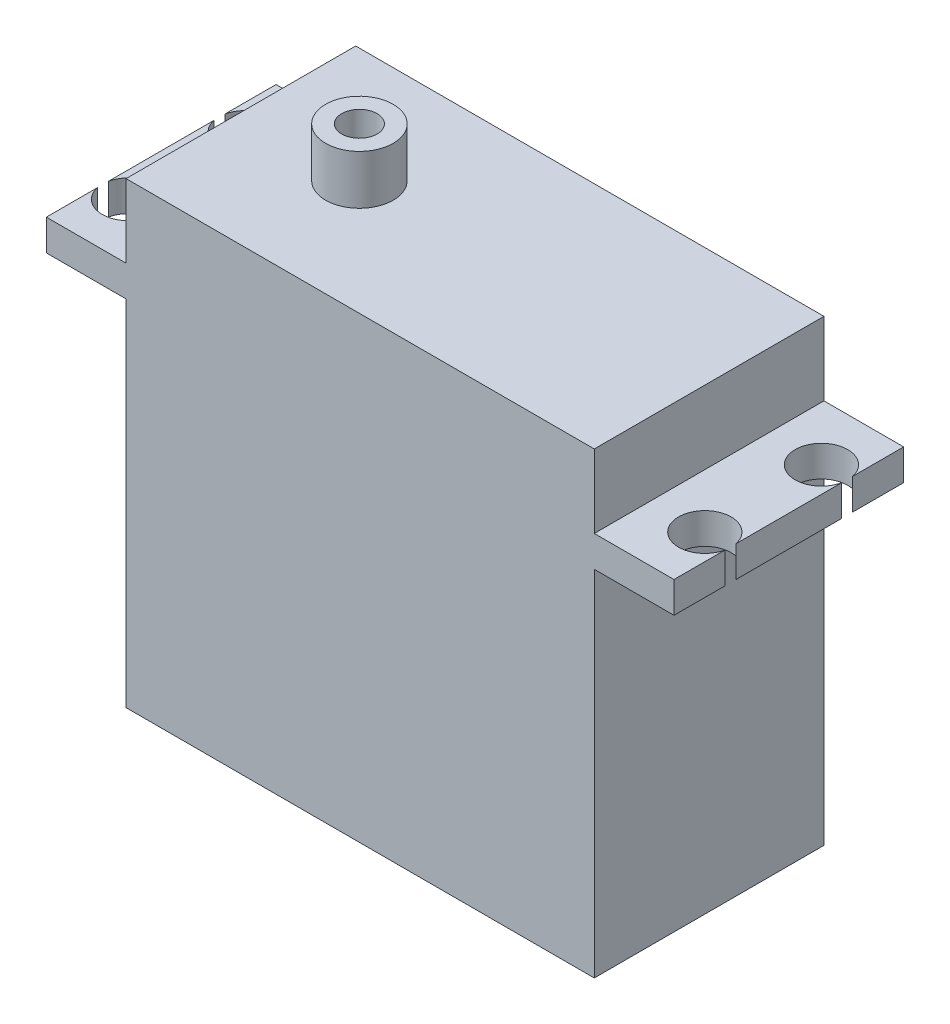
ISO-10303-21;
HEADER;
FILE_DESCRIPTION(('STEP AP214'),'2;1');
FILE_NAME('part.step','',(''),(''),'','','');
FILE_SCHEMA(('AUTOMOTIVE_DESIGN { 1 0 10303 214 1 1 1 1 }'));
ENDSEC;
DATA;
#1=APPLICATION_CONTEXT('core data for automotive mechanical design processes');
#2=APPLICATION_PROTOCOL_DEFINITION('international standard','automotive_design',2000,#1);
#3=PRODUCT_CONTEXT('',#1,'mechanical');
#4=PRODUCT('Part','Part','',(#3));
#5=PRODUCT_RELATED_PRODUCT_CATEGORY('part','',(#4));
#6=PRODUCT_DEFINITION_FORMATION('','',#4);
#7=PRODUCT_DEFINITION_CONTEXT('part definition',#1,'design');
#8=PRODUCT_DEFINITION('design','',#6,#7);
#9=PRODUCT_DEFINITION_SHAPE('','',#8);
#10=(LENGTH_UNIT() NAMED_UNIT(*) SI_UNIT(.MILLI.,.METRE.));
#11=(NAMED_UNIT(*) PLANE_ANGLE_UNIT() SI_UNIT($,.RADIAN.));
#12=(NAMED_UNIT(*) SI_UNIT($,.STERADIAN.) SOLID_ANGLE_UNIT());
#13=UNCERTAINTY_MEASURE_WITH_UNIT(LENGTH_MEASURE(1.E-05),#10,'distance_accuracy_value','');
#14=(GEOMETRIC_REPRESENTATION_CONTEXT(3) GLOBAL_UNCERTAINTY_ASSIGNED_CONTEXT((#13)) GLOBAL_UNIT_ASSIGNED_CONTEXT((#10,
#11,#12)) REPRESENTATION_CONTEXT('',''));
#15=CARTESIAN_POINT('',(0.,0.,0.));
#16=DIRECTION('',(0.,0.,1.));
#17=DIRECTION('',(1.,0.,0.));
#18=AXIS2_PLACEMENT_3D('',#15,#16,#17);
#19=CARTESIAN_POINT('',(-27.0002,0.,0.));
#20=DIRECTION('',(1.,0.,0.));
#21=DIRECTION('',(0.,0.,1.));
#22=AXIS2_PLACEMENT_3D('',#19,#20,#21);
#23=PLANE('',#22);
#24=DIRECTION('',(0.,1.,0.));
#25=VECTOR('',#24,1.);
#26=CARTESIAN_POINT('',(-27.0002,0.,-5.49304624119808));
#27=LINE('',#26,#25);
#28=CARTESIAN_POINT('',(-27.0002,33.1216,-5.49304624119807));
#29=VERTEX_POINT('',#28);
#30=CARTESIAN_POINT('',(-27.0002,30.4546,-5.49304624119807));
#31=VERTEX_POINT('',#30);
#32=EDGE_CURVE('E52',#29,#31,#27,.F.);
#33=ORIENTED_EDGE('',*,*,#32,.F.);
#34=DIRECTION('',(0.,0.,1.));
#35=VECTOR('',#34,1.);
#36=CARTESIAN_POINT('',(-27.0002,33.1216,9.8806));
#37=LINE('',#36,#35);
#38=CARTESIAN_POINT('',(-27.0002,33.1216,-9.88059999999999));
#39=VERTEX_POINT('',#38);
#40=EDGE_CURVE('E210',#39,#29,#37,.T.);
#41=ORIENTED_EDGE('',*,*,#40,.F.);
#42=DIRECTION('',(0.,1.,0.));
#43=VECTOR('',#42,1.);
#44=CARTESIAN_POINT('',(-27.0002,30.4546,-9.88059999999999));
#45=LINE('',#44,#43);
#46=CARTESIAN_POINT('',(-27.0002,30.4546,-9.88059999999999));
#47=VERTEX_POINT('',#46);
#48=EDGE_CURVE('E217',#47,#39,#45,.T.);
#49=ORIENTED_EDGE('',*,*,#48,.F.);
#50=DIRECTION('',(0.,0.,-1.));
#51=VECTOR('',#50,1.);
#52=CARTESIAN_POINT('',(-27.0002,30.4546,9.8806));
#53=LINE('',#52,#51);
#54=EDGE_CURVE('E221',#31,#47,#53,.T.);
#55=ORIENTED_EDGE('',*,*,#54,.F.);
#56=EDGE_LOOP('',(#33,#41,#49,#55));
#57=FACE_BOUND('',#56,.T.);
#58=ADVANCED_FACE('F43',(#57),#23,.F.);
#59=DIRECTION('',(0.,1.,0.));
#60=VECTOR('',#59,1.);
#61=CARTESIAN_POINT('',(-27.0002,0.,-4.53995375880192));
#62=LINE('',#61,#60);
#63=CARTESIAN_POINT('',(-27.0002,30.4546,-4.53995375880192));
#64=VERTEX_POINT('',#63);
#65=CARTESIAN_POINT('',(-27.0002,33.1216,-4.53995375880193));
#66=VERTEX_POINT('',#65);
#67=EDGE_CURVE('E372',#64,#66,#62,.T.);
#68=ORIENTED_EDGE('',*,*,#67,.F.);
#69=CARTESIAN_POINT('',(-27.0002,30.4546,4.53995375880194));
#70=VERTEX_POINT('',#69);
#71=EDGE_CURVE('E226',#70,#64,#53,.T.);
#72=ORIENTED_EDGE('',*,*,#71,.F.);
#73=DIRECTION('',(0.,1.,0.));
#74=VECTOR('',#73,1.);
#75=CARTESIAN_POINT('',(-27.0002,0.,4.53995375880195));
#76=LINE('',#75,#74);
#77=CARTESIAN_POINT('',(-27.0002,33.1216,4.53995375880194));
#78=VERTEX_POINT('',#77);
#79=EDGE_CURVE('E188',#78,#70,#76,.F.);
#80=ORIENTED_EDGE('',*,*,#79,.F.);
#81=EDGE_CURVE('E199',#66,#78,#37,.T.);
#82=ORIENTED_EDGE('',*,*,#81,.F.);
#83=EDGE_LOOP('',(#68,#72,#80,#82));
#84=FACE_BOUND('',#83,.T.);
#85=ADVANCED_FACE('F386',(#84),#23,.F.);
#86=DIRECTION('',(0.,1.,0.));
#87=VECTOR('',#86,1.);
#88=CARTESIAN_POINT('',(-27.0002,0.,5.49304624119805));
#89=LINE('',#88,#87);
#90=CARTESIAN_POINT('',(-27.0002,30.4546,5.49304624119805));
#91=VERTEX_POINT('',#90);
#92=CARTESIAN_POINT('',(-27.0002,33.1216,5.49304624119805));
#93=VERTEX_POINT('',#92);
#94=EDGE_CURVE('E178',#91,#93,#89,.T.);
#95=ORIENTED_EDGE('',*,*,#94,.F.);
#96=CARTESIAN_POINT('',(-27.0002,30.4546,9.8806));
#97=VERTEX_POINT('',#96);
#98=EDGE_CURVE('E228',#97,#91,#53,.T.);
#99=ORIENTED_EDGE('',*,*,#98,.F.);
#100=DIRECTION('',(0.,-1.,0.));
#101=VECTOR('',#100,1.);
#102=CARTESIAN_POINT('',(-27.0002,30.4546,9.8806));
#103=LINE('',#102,#101);
#104=CARTESIAN_POINT('',(-27.0002,33.1216,9.8806));
#105=VERTEX_POINT('',#104);
#106=EDGE_CURVE('E207',#105,#97,#103,.T.);
#107=ORIENTED_EDGE('',*,*,#106,.F.);
#108=EDGE_CURVE('E195',#93,#105,#37,.T.);
#109=ORIENTED_EDGE('',*,*,#108,.F.);
#110=EDGE_LOOP('',(#95,#99,#107,#109));
#111=FACE_BOUND('',#110,.T.);
#112=ADVANCED_FACE('F205',(#111),#23,.F.);
#113=CARTESIAN_POINT('',(-20.1422,39.4208,9.8806));
#114=DIRECTION('',(1.,0.,0.));
#115=DIRECTION('',(0.,0.,-1.));
#116=AXIS2_PLACEMENT_3D('',#113,#114,#115);
#117=PLANE('',#116);
#118=DIRECTION('',(0.,-1.,0.));
#119=VECTOR('',#118,1.);
#120=CARTESIAN_POINT('',(-20.1422,39.4208,9.8806));
#121=LINE('',#120,#119);
#122=CARTESIAN_POINT('',(-20.1422,30.4546,9.8806));
#123=VERTEX_POINT('',#122);
#124=CARTESIAN_POINT('',(-20.1422,0.,9.8806));
#125=VERTEX_POINT('',#124);
#126=EDGE_CURVE('E350',#123,#125,#121,.T.);
#127=ORIENTED_EDGE('',*,*,#126,.F.);
#128=DIRECTION('',(0.,0.,-1.));
#129=VECTOR('',#128,1.);
#130=CARTESIAN_POINT('',(-20.1422,30.4546,9.8806));
#131=LINE('',#130,#129);
#132=CARTESIAN_POINT('',(-20.1422,30.4546,-9.88059999999999));
#133=VERTEX_POINT('',#132);
#134=EDGE_CURVE('E213',#123,#133,#131,.T.);
#135=ORIENTED_EDGE('',*,*,#134,.T.);
#136=DIRECTION('',(0.,-1.,0.));
#137=VECTOR('',#136,1.);
#138=CARTESIAN_POINT('',(-20.1422,39.4208,-9.8806));
#139=LINE('',#138,#137);
#140=CARTESIAN_POINT('',(-20.1422,0.,-9.8806));
#141=VERTEX_POINT('',#140);
#142=EDGE_CURVE('E322',#133,#141,#139,.T.);
#143=ORIENTED_EDGE('',*,*,#142,.T.);
#144=DIRECTION('',(0.,0.,1.));
#145=VECTOR('',#144,1.);
#146=CARTESIAN_POINT('',(-20.1422,0.,9.8806));
#147=LINE('',#146,#145);
#148=EDGE_CURVE('E307',#141,#125,#147,.T.);
#149=ORIENTED_EDGE('',*,*,#148,.T.);
#150=EDGE_LOOP('',(#127,#135,#143,#149));
#151=FACE_BOUND('',#150,.T.);
#152=ADVANCED_FACE('F395',(#151),#117,.F.);
#153=CARTESIAN_POINT('',(27.0002,0.,0.));
#154=DIRECTION('',(-1.,0.,0.));
#155=DIRECTION('',(0.,0.,1.));
#156=AXIS2_PLACEMENT_3D('',#153,#154,#155);
#157=PLANE('',#156);
#158=DIRECTION('',(0.,0.,-1.));
#159=VECTOR('',#158,1.);
#160=CARTESIAN_POINT('',(27.0002,30.4546,9.8806));
#161=LINE('',#160,#159);
#162=CARTESIAN_POINT('',(27.0002,30.4546,4.53995375880195));
#163=VERTEX_POINT('',#162);
#164=CARTESIAN_POINT('',(27.0002,30.4546,-4.53995375880193));
#165=VERTEX_POINT('',#164);
#166=EDGE_CURVE('E276',#163,#165,#161,.T.);
#167=ORIENTED_EDGE('',*,*,#166,.T.);
#168=DIRECTION('',(0.,1.,0.));
#169=VECTOR('',#168,1.);
#170=CARTESIAN_POINT('',(27.0002,0.,-4.53995375880192));
#171=LINE('',#170,#169);
#172=CARTESIAN_POINT('',(27.0002,33.1216,-4.53995375880193));
#173=VERTEX_POINT('',#172);
#174=EDGE_CURVE('E189',#165,#173,#171,.T.);
#175=ORIENTED_EDGE('',*,*,#174,.T.);
#176=DIRECTION('',(0.,0.,1.));
#177=VECTOR('',#176,1.);
#178=CARTESIAN_POINT('',(27.0002,33.1216,9.8806));
#179=LINE('',#178,#177);
#180=CARTESIAN_POINT('',(27.0002,33.1216,4.53995375880194));
#181=VERTEX_POINT('',#180);
#182=EDGE_CURVE('E285',#173,#181,#179,.T.);
#183=ORIENTED_EDGE('',*,*,#182,.T.);
#184=DIRECTION('',(0.,1.,0.));
#185=VECTOR('',#184,1.);
#186=CARTESIAN_POINT('',(27.0002,0.,4.53995375880195));
#187=LINE('',#186,#185);
#188=EDGE_CURVE('E355',#181,#163,#187,.F.);
#189=ORIENTED_EDGE('',*,*,#188,.T.);
#190=EDGE_LOOP('',(#167,#175,#183,#189));
#191=FACE_BOUND('',#190,.T.);
#192=ADVANCED_FACE('F399',(#191),#157,.F.);
#193=CARTESIAN_POINT('',(27.0002,30.4546,9.8806));
#194=VERTEX_POINT('',#193);
#195=CARTESIAN_POINT('',(27.0002,30.4546,5.49304624119805));
#196=VERTEX_POINT('',#195);
#197=EDGE_CURVE('E271',#194,#196,#161,.T.);
#198=ORIENTED_EDGE('',*,*,#197,.T.);
#199=DIRECTION('',(0.,1.,0.));
#200=VECTOR('',#199,1.);
#201=CARTESIAN_POINT('',(27.0002,0.,5.49304624119805));
#202=LINE('',#201,#200);
#203=CARTESIAN_POINT('',(27.0002,33.1216,5.49304624119805));
#204=VERTEX_POINT('',#203);
#205=EDGE_CURVE('E359',#196,#204,#202,.T.);
#206=ORIENTED_EDGE('',*,*,#205,.T.);
#207=CARTESIAN_POINT('',(27.0002,33.1216,9.8806));
#208=VERTEX_POINT('',#207);
#209=EDGE_CURVE('E279',#204,#208,#179,.T.);
#210=ORIENTED_EDGE('',*,*,#209,.T.);
#211=DIRECTION('',(0.,-1.,0.));
#212=VECTOR('',#211,1.);
#213=CARTESIAN_POINT('',(27.0002,30.4546,9.8806));
#214=LINE('',#213,#212);
#215=EDGE_CURVE('E265',#208,#194,#214,.T.);
#216=ORIENTED_EDGE('',*,*,#215,.T.);
#217=EDGE_LOOP('',(#198,#206,#210,#216));
#218=FACE_BOUND('',#217,.T.);
#219=ADVANCED_FACE('F404',(#218),#157,.F.);
#220=CARTESIAN_POINT('',(20.1422,39.4208,9.8806));
#221=DIRECTION('',(-1.,0.,0.));
#222=DIRECTION('',(0.,0.,1.));
#223=AXIS2_PLACEMENT_3D('',#220,#221,#222);
#224=PLANE('',#223);
#225=DIRECTION('',(0.,0.,1.));
#226=VECTOR('',#225,1.);
#227=CARTESIAN_POINT('',(20.1422,33.1216,9.8806));
#228=LINE('',#227,#226);
#229=CARTESIAN_POINT('',(20.1422,33.1216,-9.8806));
#230=VERTEX_POINT('',#229);
#231=CARTESIAN_POINT('',(20.1422,33.1216,9.8806));
#232=VERTEX_POINT('',#231);
#233=EDGE_CURVE('E270',#230,#232,#228,.T.);
#234=ORIENTED_EDGE('',*,*,#233,.F.);
#235=DIRECTION('',(0.,-1.,0.));
#236=VECTOR('',#235,1.);
#237=CARTESIAN_POINT('',(20.1422,39.4208,-9.8806));
#238=LINE('',#237,#236);
#239=CARTESIAN_POINT('',(20.1422,39.4208,-9.8806));
#240=VERTEX_POINT('',#239);
#241=EDGE_CURVE('E342',#240,#230,#238,.T.);
#242=ORIENTED_EDGE('',*,*,#241,.F.);
#243=DIRECTION('',(0.,0.,-1.));
#244=VECTOR('',#243,1.);
#245=CARTESIAN_POINT('',(20.1422,39.4208,9.8806));
#246=LINE('',#245,#244);
#247=CARTESIAN_POINT('',(20.1422,39.4208,9.8806));
#248=VERTEX_POINT('',#247);
#249=EDGE_CURVE('E316',#248,#240,#246,.T.);
#250=ORIENTED_EDGE('',*,*,#249,.F.);
#251=DIRECTION('',(0.,-1.,0.));
#252=VECTOR('',#251,1.);
#253=CARTESIAN_POINT('',(20.1422,39.4208,9.8806));
#254=LINE('',#253,#252);
#255=EDGE_CURVE('E347',#248,#232,#254,.T.);
#256=ORIENTED_EDGE('',*,*,#255,.T.);
#257=EDGE_LOOP('',(#234,#242,#250,#256));
#258=FACE_BOUND('',#257,.T.);
#259=ADVANCED_FACE('F419',(#258),#224,.F.);
#260=DIRECTION('',(0.,0.,-1.));
#261=VECTOR('',#260,1.);
#262=CARTESIAN_POINT('',(20.1422,30.4546,9.8806));
#263=LINE('',#262,#261);
#264=CARTESIAN_POINT('',(20.1422,30.4546,9.8806));
#265=VERTEX_POINT('',#264);
#266=CARTESIAN_POINT('',(20.1422,30.4546,-9.88059999999999));
#267=VERTEX_POINT('',#266);
#268=EDGE_CURVE('E264',#265,#267,#263,.T.);
#269=ORIENTED_EDGE('',*,*,#268,.F.);
#270=CARTESIAN_POINT('',(20.1422,0.,9.8806));
#271=VERTEX_POINT('',#270);
#272=EDGE_CURVE('E346',#265,#271,#254,.T.);
#273=ORIENTED_EDGE('',*,*,#272,.T.);
#274=DIRECTION('',(0.,0.,-1.));
#275=VECTOR('',#274,1.);
#276=CARTESIAN_POINT('',(20.1422,0.,9.8806));
#277=LINE('',#276,#275);
#278=CARTESIAN_POINT('',(20.1422,0.,-9.8806));
#279=VERTEX_POINT('',#278);
#280=EDGE_CURVE('E330',#271,#279,#277,.T.);
#281=ORIENTED_EDGE('',*,*,#280,.T.);
#282=EDGE_CURVE('E341',#267,#279,#238,.T.);
#283=ORIENTED_EDGE('',*,*,#282,.F.);
#284=EDGE_LOOP('',(#269,#273,#281,#283));
#285=FACE_BOUND('',#284,.T.);
#286=ADVANCED_FACE('F411',(#285),#224,.F.);
#287=CARTESIAN_POINT('',(-20.1422,39.4208,-9.8806));
#288=VERTEX_POINT('',#287);
#289=CARTESIAN_POINT('',(-20.1422,33.1216,-9.88059999999999));
#290=VERTEX_POINT('',#289);
#291=EDGE_CURVE('E337',#288,#290,#139,.T.);
#292=ORIENTED_EDGE('',*,*,#291,.T.);
#293=DIRECTION('',(0.,0.,1.));
#294=VECTOR('',#293,1.);
#295=CARTESIAN_POINT('',(-20.1422,33.1216,9.8806));
#296=LINE('',#295,#294);
#297=CARTESIAN_POINT('',(-20.1422,33.1216,9.8806));
#298=VERTEX_POINT('',#297);
#299=EDGE_CURVE('E232',#290,#298,#296,.T.);
#300=ORIENTED_EDGE('',*,*,#299,.T.);
#301=CARTESIAN_POINT('',(-20.1422,39.4208,9.8806));
#302=VERTEX_POINT('',#301);
#303=EDGE_CURVE('E351',#302,#298,#121,.T.);
#304=ORIENTED_EDGE('',*,*,#303,.F.);
#305=DIRECTION('',(0.,0.,1.));
#306=VECTOR('',#305,1.);
#307=CARTESIAN_POINT('',(-20.1422,39.4208,9.8806));
#308=LINE('',#307,#306);
#309=EDGE_CURVE('E308',#288,#302,#308,.T.);
#310=ORIENTED_EDGE('',*,*,#309,.F.);
#311=EDGE_LOOP('',(#292,#300,#304,#310));
#312=FACE_BOUND('',#311,.T.);
#313=ADVANCED_FACE('F45',(#312),#117,.F.);
#314=CARTESIAN_POINT('',(-20.1422,39.4208,9.8806));
#315=DIRECTION('',(0.,0.,-1.));
#316=DIRECTION('',(-1.,0.,0.));
#317=AXIS2_PLACEMENT_3D('',#314,#315,#316);
#318=PLANE('',#317);
#319=DIRECTION('',(1.,0.,0.));
#320=VECTOR('',#319,1.);
#321=CARTESIAN_POINT('',(-20.1422,0.,9.8806));
#322=LINE('',#321,#320);
#323=EDGE_CURVE('E326',#125,#271,#322,.T.);
#324=ORIENTED_EDGE('',*,*,#323,.T.);
#325=ORIENTED_EDGE('',*,*,#272,.F.);
#326=DIRECTION('',(-1.,0.,0.));
#327=VECTOR('',#326,1.);
#328=CARTESIAN_POINT('',(27.0002,30.4546,9.8806));
#329=LINE('',#328,#327);
#330=EDGE_CURVE('E303',#194,#265,#329,.T.);
#331=ORIENTED_EDGE('',*,*,#330,.F.);
#332=ORIENTED_EDGE('',*,*,#215,.F.);
#333=DIRECTION('',(-1.,0.,0.));
#334=VECTOR('',#333,1.);
#335=CARTESIAN_POINT('',(27.0002,33.1216,9.8806));
#336=LINE('',#335,#334);
#337=EDGE_CURVE('E284',#208,#232,#336,.T.);
#338=ORIENTED_EDGE('',*,*,#337,.T.);
#339=ORIENTED_EDGE('',*,*,#255,.F.);
#340=DIRECTION('',(1.,0.,0.));
#341=VECTOR('',#340,1.);
#342=CARTESIAN_POINT('',(-20.1422,39.4208,9.8806));
#343=LINE('',#342,#341);
#344=EDGE_CURVE('E312',#302,#248,#343,.T.);
#345=ORIENTED_EDGE('',*,*,#344,.F.);
#346=ORIENTED_EDGE('',*,*,#303,.T.);
#347=DIRECTION('',(1.,0.,0.));
#348=VECTOR('',#347,1.);
#349=CARTESIAN_POINT('',(-27.0002,33.1216,9.8806));
#350=LINE('',#349,#348);
#351=EDGE_CURVE('E247',#105,#298,#350,.T.);
#352=ORIENTED_EDGE('',*,*,#351,.F.);
#353=ORIENTED_EDGE('',*,*,#106,.T.);
#354=DIRECTION('',(1.,0.,0.));
#355=VECTOR('',#354,1.);
#356=CARTESIAN_POINT('',(-27.0002,30.4546,9.8806));
#357=LINE('',#356,#355);
#358=EDGE_CURVE('E231',#97,#123,#357,.T.);
#359=ORIENTED_EDGE('',*,*,#358,.T.);
#360=ORIENTED_EDGE('',*,*,#126,.T.);
#361=EDGE_LOOP('',(#324,#325,#331,#332,#338,#339,#345,#346,#352,#353,#359,#360));
#362=FACE_BOUND('',#361,.T.);
#363=ADVANCED_FACE('F410',(#362),#318,.F.);
#364=CARTESIAN_POINT('',(-20.1422,39.4208,-9.8806));
#365=DIRECTION('',(0.,0.,1.));
#366=DIRECTION('',(1.,0.,0.));
#367=AXIS2_PLACEMENT_3D('',#364,#365,#366);
#368=PLANE('',#367);
#369=DIRECTION('',(-1.,0.,0.));
#370=VECTOR('',#369,1.);
#371=CARTESIAN_POINT('',(-20.1422,0.,-9.8806));
#372=LINE('',#371,#370);
#373=EDGE_CURVE('E313',#279,#141,#372,.T.);
#374=ORIENTED_EDGE('',*,*,#373,.T.);
#375=ORIENTED_EDGE('',*,*,#142,.F.);
#376=DIRECTION('',(1.,0.,0.));
#377=VECTOR('',#376,1.);
#378=CARTESIAN_POINT('',(-27.0002,30.4546,-9.88059999999999));
#379=LINE('',#378,#377);
#380=EDGE_CURVE('E241',#47,#133,#379,.T.);
#381=ORIENTED_EDGE('',*,*,#380,.F.);
#382=ORIENTED_EDGE('',*,*,#48,.T.);
#383=DIRECTION('',(1.,0.,0.));
#384=VECTOR('',#383,1.);
#385=CARTESIAN_POINT('',(-27.0002,33.1216,-9.88059999999999));
#386=LINE('',#385,#384);
#387=EDGE_CURVE('E244',#39,#290,#386,.T.);
#388=ORIENTED_EDGE('',*,*,#387,.T.);
#389=ORIENTED_EDGE('',*,*,#291,.F.);
#390=DIRECTION('',(-1.,0.,0.));
#391=VECTOR('',#390,1.);
#392=CARTESIAN_POINT('',(-20.1422,39.4208,-9.8806));
#393=LINE('',#392,#391);
#394=EDGE_CURVE('E319',#240,#288,#393,.T.);
#395=ORIENTED_EDGE('',*,*,#394,.F.);
#396=ORIENTED_EDGE('',*,*,#241,.T.);
#397=DIRECTION('',(-1.,0.,0.));
#398=VECTOR('',#397,1.);
#399=CARTESIAN_POINT('',(27.0002,33.1216,-9.88059999999999));
#400=LINE('',#399,#398);
#401=CARTESIAN_POINT('',(27.0002,33.1216,-9.88059999999999));
#402=VERTEX_POINT('',#401);
#403=EDGE_CURVE('E295',#402,#230,#400,.T.);
#404=ORIENTED_EDGE('',*,*,#403,.F.);
#405=DIRECTION('',(0.,1.,0.));
#406=VECTOR('',#405,1.);
#407=CARTESIAN_POINT('',(27.0002,30.4546,-9.88059999999999));
#408=LINE('',#407,#406);
#409=CARTESIAN_POINT('',(27.0002,30.4546,-9.88059999999999));
#410=VERTEX_POINT('',#409);
#411=EDGE_CURVE('E275',#410,#402,#408,.T.);
#412=ORIENTED_EDGE('',*,*,#411,.F.);
#413=DIRECTION('',(-1.,0.,0.));
#414=VECTOR('',#413,1.);
#415=CARTESIAN_POINT('',(27.0002,30.4546,-9.88059999999999));
#416=LINE('',#415,#414);
#417=EDGE_CURVE('E299',#410,#267,#416,.T.);
#418=ORIENTED_EDGE('',*,*,#417,.T.);
#419=ORIENTED_EDGE('',*,*,#282,.T.);
#420=EDGE_LOOP('',(#374,#375,#381,#382,#388,#389,#395,#396,#404,#412,#418,#419));
#421=FACE_BOUND('',#420,.T.);
#422=ADVANCED_FACE('F417',(#421),#368,.F.);
#423=CARTESIAN_POINT('',(0.,39.4208,0.));
#424=DIRECTION('',(0.,-1.,0.));
#425=DIRECTION('',(0.,0.,-1.));
#426=AXIS2_PLACEMENT_3D('',#423,#424,#425);
#427=PLANE('',#426);
#428=CARTESIAN_POINT('',(-9.9441,39.4208,0.));
#429=DIRECTION('',(0.,-1.,0.));
#430=DIRECTION('',(0.,0.,-1.));
#431=AXIS2_PLACEMENT_3D('',#428,#429,#430);
#432=CIRCLE('',#431,2.9083);
#433=CARTESIAN_POINT('',(-9.9441,39.4208,-2.9083));
#434=VERTEX_POINT('',#433);
#435=EDGE_CURVE('E11',#434,#434,#432,.F.);
#436=ORIENTED_EDGE('',*,*,#435,.F.);
#437=EDGE_LOOP('',(#436));
#438=FACE_BOUND('',#437,.T.);
#439=ORIENTED_EDGE('',*,*,#309,.T.);
#440=ORIENTED_EDGE('',*,*,#344,.T.);
#441=ORIENTED_EDGE('',*,*,#249,.T.);
#442=ORIENTED_EDGE('',*,*,#394,.T.);
#443=EDGE_LOOP('',(#439,#440,#441,#442));
#444=FACE_BOUND('',#443,.T.);
#445=ADVANCED_FACE('F430',(#438,#444),#427,.F.);
#446=CARTESIAN_POINT('',(0.,0.,0.));
#447=DIRECTION('',(0.,-1.,0.));
#448=DIRECTION('',(0.,0.,-1.));
#449=AXIS2_PLACEMENT_3D('',#446,#447,#448);
#450=PLANE('',#449);
#451=ORIENTED_EDGE('',*,*,#148,.F.);
#452=ORIENTED_EDGE('',*,*,#373,.F.);
#453=ORIENTED_EDGE('',*,*,#280,.F.);
#454=ORIENTED_EDGE('',*,*,#323,.F.);
#455=EDGE_LOOP('',(#451,#452,#453,#454));
#456=FACE_BOUND('',#455,.T.);
#457=ADVANCED_FACE('F481',(#456),#450,.T.);
#458=CARTESIAN_POINT('',(27.0002,30.4546,9.8806));
#459=DIRECTION('',(0.,1.,0.));
#460=DIRECTION('',(0.,0.,1.));
#461=AXIS2_PLACEMENT_3D('',#458,#459,#460);
#462=PLANE('',#461);
#463=CARTESIAN_POINT('',(27.0002,30.4546,-5.49304624119808));
#464=VERTEX_POINT('',#463);
#465=EDGE_CURVE('E269',#464,#410,#161,.T.);
#466=ORIENTED_EDGE('',*,*,#465,.F.);
#467=CARTESIAN_POINT('',(24.7904,30.4546,-5.0165));
#468=DIRECTION('',(0.,1.,0.));
#469=DIRECTION('',(0.,0.,1.));
#470=AXIS2_PLACEMENT_3D('',#467,#468,#469);
#471=CIRCLE('',#470,2.2606);
#472=EDGE_CURVE('E260',#464,#165,#471,.T.);
#473=ORIENTED_EDGE('',*,*,#472,.T.);
#474=ORIENTED_EDGE('',*,*,#166,.F.);
#475=CARTESIAN_POINT('',(24.7904,30.4546,5.0165));
#476=DIRECTION('',(0.,1.,0.));
#477=DIRECTION('',(0.,0.,1.));
#478=AXIS2_PLACEMENT_3D('',#475,#476,#477);
#479=CIRCLE('',#478,2.2606);
#480=EDGE_CURVE('E254',#163,#196,#479,.T.);
#481=ORIENTED_EDGE('',*,*,#480,.T.);
#482=ORIENTED_EDGE('',*,*,#197,.F.);
#483=ORIENTED_EDGE('',*,*,#330,.T.);
#484=ORIENTED_EDGE('',*,*,#268,.T.);
#485=ORIENTED_EDGE('',*,*,#417,.F.);
#486=EDGE_LOOP('',(#466,#473,#474,#481,#482,#483,#484,#485));
#487=FACE_BOUND('',#486,.T.);
#488=ADVANCED_FACE('F445',(#487),#462,.F.);
#489=CARTESIAN_POINT('',(27.0002,33.1216,9.8806));
#490=DIRECTION('',(0.,-1.,0.));
#491=DIRECTION('',(0.,0.,-1.));
#492=AXIS2_PLACEMENT_3D('',#489,#490,#491);
#493=PLANE('',#492);
#494=ORIENTED_EDGE('',*,*,#182,.F.);
#495=CARTESIAN_POINT('',(24.7904,33.1216,-5.0165));
#496=DIRECTION('',(0.,1.,0.));
#497=DIRECTION('',(0.,0.,1.));
#498=AXIS2_PLACEMENT_3D('',#495,#496,#497);
#499=CIRCLE('',#498,2.2606);
#500=CARTESIAN_POINT('',(27.0002,33.1216,-5.49304624119807));
#501=VERTEX_POINT('',#500);
#502=EDGE_CURVE('E251',#501,#173,#499,.T.);
#503=ORIENTED_EDGE('',*,*,#502,.F.);
#504=EDGE_CURVE('E280',#402,#501,#179,.T.);
#505=ORIENTED_EDGE('',*,*,#504,.F.);
#506=ORIENTED_EDGE('',*,*,#403,.T.);
#507=ORIENTED_EDGE('',*,*,#233,.T.);
#508=ORIENTED_EDGE('',*,*,#337,.F.);
#509=ORIENTED_EDGE('',*,*,#209,.F.);
#510=CARTESIAN_POINT('',(24.7904,33.1216,5.0165));
#511=DIRECTION('',(0.,1.,0.));
#512=DIRECTION('',(0.,0.,-1.));
#513=AXIS2_PLACEMENT_3D('',#510,#511,#512);
#514=CIRCLE('',#513,2.2606);
#515=EDGE_CURVE('E250',#181,#204,#514,.T.);
#516=ORIENTED_EDGE('',*,*,#515,.F.);
#517=EDGE_LOOP('',(#494,#503,#505,#506,#507,#508,#509,#516));
#518=FACE_BOUND('',#517,.T.);
#519=ADVANCED_FACE('F438',(#518),#493,.F.);
#520=ORIENTED_EDGE('',*,*,#504,.T.);
#521=DIRECTION('',(0.,1.,0.));
#522=VECTOR('',#521,1.);
#523=CARTESIAN_POINT('',(27.0002,0.,-5.49304624119808));
#524=LINE('',#523,#522);
#525=EDGE_CURVE('E363',#501,#464,#524,.F.);
#526=ORIENTED_EDGE('',*,*,#525,.T.);
#527=ORIENTED_EDGE('',*,*,#465,.T.);
#528=ORIENTED_EDGE('',*,*,#411,.T.);
#529=EDGE_LOOP('',(#520,#526,#527,#528));
#530=FACE_BOUND('',#529,.T.);
#531=ADVANCED_FACE('F407',(#530),#157,.F.);
#532=CARTESIAN_POINT('',(24.7904,0.,5.0165));
#533=DIRECTION('',(0.,1.,0.));
#534=DIRECTION('',(0.,0.,1.));
#535=AXIS2_PLACEMENT_3D('',#532,#533,#534);
#536=CYLINDRICAL_SURFACE('',#535,2.2606);
#537=ORIENTED_EDGE('',*,*,#480,.F.);
#538=ORIENTED_EDGE('',*,*,#188,.F.);
#539=ORIENTED_EDGE('',*,*,#515,.T.);
#540=ORIENTED_EDGE('',*,*,#205,.F.);
#541=EDGE_LOOP('',(#537,#538,#539,#540));
#542=FACE_BOUND('',#541,.T.);
#543=ADVANCED_FACE('F466',(#542),#536,.F.);
#544=CARTESIAN_POINT('',(24.7904,0.,-5.0165));
#545=DIRECTION('',(0.,1.,0.));
#546=DIRECTION('',(0.,0.,1.));
#547=AXIS2_PLACEMENT_3D('',#544,#545,#546);
#548=CYLINDRICAL_SURFACE('',#547,2.2606);
#549=ORIENTED_EDGE('',*,*,#472,.F.);
#550=ORIENTED_EDGE('',*,*,#525,.F.);
#551=ORIENTED_EDGE('',*,*,#502,.T.);
#552=ORIENTED_EDGE('',*,*,#174,.F.);
#553=EDGE_LOOP('',(#549,#550,#551,#552));
#554=FACE_BOUND('',#553,.T.);
#555=ADVANCED_FACE('F464',(#554),#548,.F.);
#556=CARTESIAN_POINT('',(-27.0002,33.1216,9.8806));
#557=DIRECTION('',(0.,1.,0.));
#558=DIRECTION('',(0.,0.,1.));
#559=AXIS2_PLACEMENT_3D('',#556,#557,#558);
#560=PLANE('',#559);
#561=ORIENTED_EDGE('',*,*,#40,.T.);
#562=CARTESIAN_POINT('',(-24.7904,33.1216,-5.0165));
#563=DIRECTION('',(0.,-1.,0.));
#564=DIRECTION('',(0.,0.,1.));
#565=AXIS2_PLACEMENT_3D('',#562,#563,#564);
#566=CIRCLE('',#565,2.2606);
#567=EDGE_CURVE('E201',#29,#66,#566,.T.);
#568=ORIENTED_EDGE('',*,*,#567,.T.);
#569=ORIENTED_EDGE('',*,*,#81,.T.);
#570=CARTESIAN_POINT('',(-24.7904,33.1216,5.0165));
#571=DIRECTION('',(0.,-1.,0.));
#572=DIRECTION('',(0.,0.,-1.));
#573=AXIS2_PLACEMENT_3D('',#570,#571,#572);
#574=CIRCLE('',#573,2.2606);
#575=EDGE_CURVE('E181',#78,#93,#574,.T.);
#576=ORIENTED_EDGE('',*,*,#575,.T.);
#577=ORIENTED_EDGE('',*,*,#108,.T.);
#578=ORIENTED_EDGE('',*,*,#351,.T.);
#579=ORIENTED_EDGE('',*,*,#299,.F.);
#580=ORIENTED_EDGE('',*,*,#387,.F.);
#581=EDGE_LOOP('',(#561,#568,#569,#576,#577,#578,#579,#580));
#582=FACE_BOUND('',#581,.T.);
#583=ADVANCED_FACE('F194',(#582),#560,.T.);
#584=CARTESIAN_POINT('',(-27.0002,30.4546,9.8806));
#585=DIRECTION('',(0.,-1.,0.));
#586=DIRECTION('',(0.,0.,-1.));
#587=AXIS2_PLACEMENT_3D('',#584,#585,#586);
#588=PLANE('',#587);
#589=ORIENTED_EDGE('',*,*,#71,.T.);
#590=CARTESIAN_POINT('',(-24.7904,30.4546,-5.0165));
#591=DIRECTION('',(0.,-1.,0.));
#592=DIRECTION('',(0.,0.,-1.));
#593=AXIS2_PLACEMENT_3D('',#590,#591,#592);
#594=CIRCLE('',#593,2.2606);
#595=EDGE_CURVE('E59',#64,#31,#594,.F.);
#596=ORIENTED_EDGE('',*,*,#595,.T.);
#597=ORIENTED_EDGE('',*,*,#54,.T.);
#598=ORIENTED_EDGE('',*,*,#380,.T.);
#599=ORIENTED_EDGE('',*,*,#134,.F.);
#600=ORIENTED_EDGE('',*,*,#358,.F.);
#601=ORIENTED_EDGE('',*,*,#98,.T.);
#602=CARTESIAN_POINT('',(-24.7904,30.4546,5.0165));
#603=DIRECTION('',(0.,-1.,0.));
#604=DIRECTION('',(0.,0.,-1.));
#605=AXIS2_PLACEMENT_3D('',#602,#603,#604);
#606=CIRCLE('',#605,2.2606);
#607=EDGE_CURVE('E67',#91,#70,#606,.F.);
#608=ORIENTED_EDGE('',*,*,#607,.T.);
#609=EDGE_LOOP('',(#589,#596,#597,#598,#599,#600,#601,#608));
#610=FACE_BOUND('',#609,.T.);
#611=ADVANCED_FACE('F381',(#610),#588,.T.);
#612=CARTESIAN_POINT('',(-24.7904,0.,5.0165));
#613=DIRECTION('',(0.,1.,0.));
#614=DIRECTION('',(0.,0.,1.));
#615=AXIS2_PLACEMENT_3D('',#612,#613,#614);
#616=CYLINDRICAL_SURFACE('',#615,2.2606);
#617=ORIENTED_EDGE('',*,*,#79,.T.);
#618=ORIENTED_EDGE('',*,*,#607,.F.);
#619=ORIENTED_EDGE('',*,*,#94,.T.);
#620=ORIENTED_EDGE('',*,*,#575,.F.);
#621=EDGE_LOOP('',(#617,#618,#619,#620));
#622=FACE_BOUND('',#621,.T.);
#623=ADVANCED_FACE('F180',(#622),#616,.F.);
#624=CARTESIAN_POINT('',(-24.7904,0.,-5.0165));
#625=DIRECTION('',(0.,1.,0.));
#626=DIRECTION('',(0.,0.,1.));
#627=AXIS2_PLACEMENT_3D('',#624,#625,#626);
#628=CYLINDRICAL_SURFACE('',#627,2.2606);
#629=ORIENTED_EDGE('',*,*,#32,.T.);
#630=ORIENTED_EDGE('',*,*,#595,.F.);
#631=ORIENTED_EDGE('',*,*,#67,.T.);
#632=ORIENTED_EDGE('',*,*,#567,.F.);
#633=EDGE_LOOP('',(#629,#630,#631,#632));
#634=FACE_BOUND('',#633,.T.);
#635=ADVANCED_FACE('F376',(#634),#628,.F.);
#636=CARTESIAN_POINT('',(-9.9441,43.6626,0.));
#637=DIRECTION('',(0.,-1.,0.));
#638=DIRECTION('',(0.,0.,-1.));
#639=AXIS2_PLACEMENT_3D('',#636,#637,#638);
#640=CYLINDRICAL_SURFACE('',#639,2.9083);
#641=CARTESIAN_POINT('',(-9.9441,43.6626,0.));
#642=DIRECTION('',(0.,1.,0.));
#643=DIRECTION('',(0.,0.,1.));
#644=AXIS2_PLACEMENT_3D('',#641,#642,#643);
#645=CIRCLE('',#644,2.9083);
#646=CARTESIAN_POINT('',(-9.9441,43.6626,-2.9083));
#647=VERTEX_POINT('',#646);
#648=EDGE_CURVE('E202',#647,#647,#645,.T.);
#649=CARTESIAN_POINT('',(-9.9441,43.6626,-2.9083));
#650=CARTESIAN_POINT('',(-9.9441,43.6184145833333,-2.9083));
#651=CARTESIAN_POINT('',(-9.9441,43.5742291666667,-2.9083));
#652=CARTESIAN_POINT('',(-9.9441,43.4858583333333,-2.9083));
#653=CARTESIAN_POINT('',(-9.9441,43.4416729166667,-2.9083));
#654=CARTESIAN_POINT('',(-9.9441,43.3533020833333,-2.9083));
#655=CARTESIAN_POINT('',(-9.9441,43.3091166666667,-2.9083));
#656=CARTESIAN_POINT('',(-9.9441,43.2207458333333,-2.9083));
#657=CARTESIAN_POINT('',(-9.9441,43.1765604166667,-2.9083));
#658=CARTESIAN_POINT('',(-9.9441,43.0881895833333,-2.9083));
#659=CARTESIAN_POINT('',(-9.9441,43.0440041666667,-2.9083));
#660=CARTESIAN_POINT('',(-9.9441,42.9556333333333,-2.9083));
#661=CARTESIAN_POINT('',(-9.9441,42.9114479166667,-2.9083));
#662=CARTESIAN_POINT('',(-9.9441,42.8230770833333,-2.9083));
#663=CARTESIAN_POINT('',(-9.9441,42.7788916666667,-2.9083));
#664=CARTESIAN_POINT('',(-9.9441,42.6905208333333,-2.9083));
#665=CARTESIAN_POINT('',(-9.9441,42.6463354166667,-2.9083));
#666=CARTESIAN_POINT('',(-9.9441,42.5579645833333,-2.9083));
#667=CARTESIAN_POINT('',(-9.9441,42.5137791666667,-2.9083));
#668=CARTESIAN_POINT('',(-9.9441,42.4254083333333,-2.9083));
#669=CARTESIAN_POINT('',(-9.9441,42.3812229166667,-2.9083));
#670=CARTESIAN_POINT('',(-9.9441,42.2928520833333,-2.9083));
#671=CARTESIAN_POINT('',(-9.9441,42.2486666666667,-2.9083));
#672=CARTESIAN_POINT('',(-9.9441,42.1602958333333,-2.9083));
#673=CARTESIAN_POINT('',(-9.9441,42.1161104166667,-2.9083));
#674=CARTESIAN_POINT('',(-9.9441,42.0277395833333,-2.9083));
#675=CARTESIAN_POINT('',(-9.9441,41.9835541666667,-2.9083));
#676=CARTESIAN_POINT('',(-9.9441,41.8951833333333,-2.9083));
#677=CARTESIAN_POINT('',(-9.9441,41.8509979166667,-2.9083));
#678=CARTESIAN_POINT('',(-9.9441,41.7626270833333,-2.9083));
#679=CARTESIAN_POINT('',(-9.9441,41.7184416666667,-2.9083));
#680=CARTESIAN_POINT('',(-9.9441,41.6300708333333,-2.9083));
#681=CARTESIAN_POINT('',(-9.9441,41.5858854166667,-2.9083));
#682=CARTESIAN_POINT('',(-9.9441,41.4975145833333,-2.9083));
#683=CARTESIAN_POINT('',(-9.9441,41.4533291666667,-2.9083));
#684=CARTESIAN_POINT('',(-9.9441,41.3649583333333,-2.9083));
#685=CARTESIAN_POINT('',(-9.9441,41.3207729166667,-2.9083));
#686=CARTESIAN_POINT('',(-9.9441,41.2324020833333,-2.9083));
#687=CARTESIAN_POINT('',(-9.9441,41.1882166666667,-2.9083));
#688=CARTESIAN_POINT('',(-9.9441,41.0998458333333,-2.9083));
#689=CARTESIAN_POINT('',(-9.9441,41.0556604166667,-2.9083));
#690=CARTESIAN_POINT('',(-9.9441,40.9672895833333,-2.9083));
#691=CARTESIAN_POINT('',(-9.9441,40.9231041666667,-2.9083));
#692=CARTESIAN_POINT('',(-9.9441,40.8347333333333,-2.9083));
#693=CARTESIAN_POINT('',(-9.9441,40.7905479166667,-2.9083));
#694=CARTESIAN_POINT('',(-9.9441,40.7021770833333,-2.9083));
#695=CARTESIAN_POINT('',(-9.9441,40.6579916666667,-2.9083));
#696=CARTESIAN_POINT('',(-9.9441,40.5696208333333,-2.9083));
#697=CARTESIAN_POINT('',(-9.9441,40.5254354166667,-2.9083));
#698=CARTESIAN_POINT('',(-9.9441,40.4370645833333,-2.9083));
#699=CARTESIAN_POINT('',(-9.9441,40.3928791666667,-2.9083));
#700=CARTESIAN_POINT('',(-9.9441,40.3045083333333,-2.9083));
#701=CARTESIAN_POINT('',(-9.9441,40.2603229166667,-2.9083));
#702=CARTESIAN_POINT('',(-9.9441,40.1719520833333,-2.9083));
#703=CARTESIAN_POINT('',(-9.9441,40.1277666666667,-2.9083));
#704=CARTESIAN_POINT('',(-9.9441,40.0393958333333,-2.9083));
#705=CARTESIAN_POINT('',(-9.9441,39.9952104166667,-2.9083));
#706=CARTESIAN_POINT('',(-9.9441,39.9068395833333,-2.9083));
#707=CARTESIAN_POINT('',(-9.9441,39.8626541666667,-2.9083));
#708=CARTESIAN_POINT('',(-9.9441,39.7742833333333,-2.9083));
#709=CARTESIAN_POINT('',(-9.9441,39.7300979166667,-2.9083));
#710=CARTESIAN_POINT('',(-9.9441,39.6417270833333,-2.9083));
#711=CARTESIAN_POINT('',(-9.9441,39.5975416666667,-2.9083));
#712=CARTESIAN_POINT('',(-9.9441,39.5091708333333,-2.9083));
#713=CARTESIAN_POINT('',(-9.9441,39.4649854166667,-2.9083));
#714=CARTESIAN_POINT('',(-9.9441,39.4208,-2.9083));
#715=B_SPLINE_CURVE_WITH_KNOTS('',3,(#649,#650,#651,#652,#653,#654,#655,#656,#657,#658,#659,
#660,#661,#662,#663,#664,#665,#666,#667,#668,#669,#670,#671,#672,#673,#674,#675,#676,#677,#678,
#679,#680,#681,#682,#683,#684,#685,#686,#687,#688,#689,#690,#691,#692,#693,#694,#695,#696,#697,
#698,#699,#700,#701,#702,#703,#704,#705,#706,#707,#708,#709,#710,#711,#712,#713,#714),
.UNSPECIFIED.,.F.,.F.,(4,2,2,2,2,2,2,2,2,2,2,2,2,2,2,2,2,2,2,2,2,2,2,2,2,2,2,2,2,2,2,2,4),(0.,
0.132556250000006,0.265112500000005,0.397668750000003,0.530225000000002,0.662781250000001,
0.7953375,0.927893749999999,1.06045,1.19300625,1.3255625,1.45811875,1.590675,1.72323125,
1.8557875,1.98834375,2.1209,2.25345625,2.3860125,2.51856875,2.651125,2.78368125,
2.91623749999999,3.04879375,3.18135,3.31390625,3.4464625,3.57901875,3.71157499999999,
3.84413124999999,3.97668749999999,4.10924374999999,4.2418),.UNSPECIFIED.);
#716=EDGE_CURVE('BSEAM618',#647,#434,#715,.T.);
#717=ORIENTED_EDGE('',*,*,#648,.F.);
#718=ORIENTED_EDGE('',*,*,#435,.T.);
#719=ORIENTED_EDGE('',*,*,#716,.T.);
#720=ORIENTED_EDGE('',*,*,#716,.F.);
#721=EDGE_LOOP('',(#717,#719,#718,#720));
#722=FACE_BOUND('',#721,.T.);
#723=ADVANCED_FACE('F618',(#722),#640,.T.);
#724=CARTESIAN_POINT('',(-9.9441,43.6626,0.));
#725=DIRECTION('',(0.,1.,0.));
#726=DIRECTION('',(0.,0.,1.));
#727=AXIS2_PLACEMENT_3D('',#724,#725,#726);
#728=PLANE('',#727);
#729=CARTESIAN_POINT('',(-9.9441,43.6626,0.));
#730=DIRECTION('',(0.,1.,0.));
#731=DIRECTION('',(0.,0.,1.));
#732=AXIS2_PLACEMENT_3D('',#729,#730,#731);
#733=CIRCLE('',#732,1.524);
#734=CARTESIAN_POINT('',(-9.9441,43.6626,1.524));
#735=VERTEX_POINT('',#734);
#736=EDGE_CURVE('E684',#735,#735,#733,.T.);
#737=ORIENTED_EDGE('',*,*,#736,.F.);
#738=EDGE_LOOP('',(#737));
#739=FACE_BOUND('',#738,.T.);
#740=ORIENTED_EDGE('',*,*,#648,.T.);
#741=EDGE_LOOP('',(#740));
#742=FACE_BOUND('',#741,.T.);
#743=ADVANCED_FACE('F634',(#739,#742),#728,.T.);
#744=CARTESIAN_POINT('',(-9.9441,36.2204,0.));
#745=DIRECTION('',(0.,1.,0.));
#746=DIRECTION('',(0.,0.,1.));
#747=AXIS2_PLACEMENT_3D('',#744,#745,#746);
#748=CYLINDRICAL_SURFACE('',#747,1.524);
#749=CARTESIAN_POINT('',(-9.9441,36.2204,0.));
#750=DIRECTION('',(0.,1.,0.));
#751=DIRECTION('',(0.,0.,1.));
#752=AXIS2_PLACEMENT_3D('',#749,#750,#751);
#753=CIRCLE('',#752,1.524);
#754=CARTESIAN_POINT('',(-9.9441,36.2204,1.524));
#755=VERTEX_POINT('',#754);
#756=EDGE_CURVE('E682',#755,#755,#753,.T.);
#757=ORIENTED_EDGE('',*,*,#756,.F.);
#758=EDGE_LOOP('',(#757));
#759=FACE_BOUND('',#758,.T.);
#760=ORIENTED_EDGE('',*,*,#736,.T.);
#761=EDGE_LOOP('',(#760));
#762=FACE_BOUND('',#761,.T.);
#763=ADVANCED_FACE('F645',(#759,#762),#748,.F.);
#764=CARTESIAN_POINT('',(-9.9441,36.2204,0.));
#765=DIRECTION('',(0.,1.,0.));
#766=DIRECTION('',(0.,0.,1.));
#767=AXIS2_PLACEMENT_3D('',#764,#765,#766);
#768=PLANE('',#767);
#769=ORIENTED_EDGE('',*,*,#756,.T.);
#770=EDGE_LOOP('',(#769));
#771=FACE_BOUND('',#770,.T.);
#772=ADVANCED_FACE('F656',(#771),#768,.T.);
#773=CLOSED_SHELL('',(#58,#85,#112,#152,#192,#219,#259,#286,#313,#363,#422,#445,#457,#488,#519,
#531,#543,#555,#583,#611,#623,#635,#723,#743,#763,#772));
#774=MANIFOLD_SOLID_BREP('B2',#773);
#775=ADVANCED_BREP_SHAPE_REPRESENTATION('',(#18,#774),#14);
#776=SHAPE_DEFINITION_REPRESENTATION(#9,#775);
ENDSEC;
END-ISO-10303-21;
